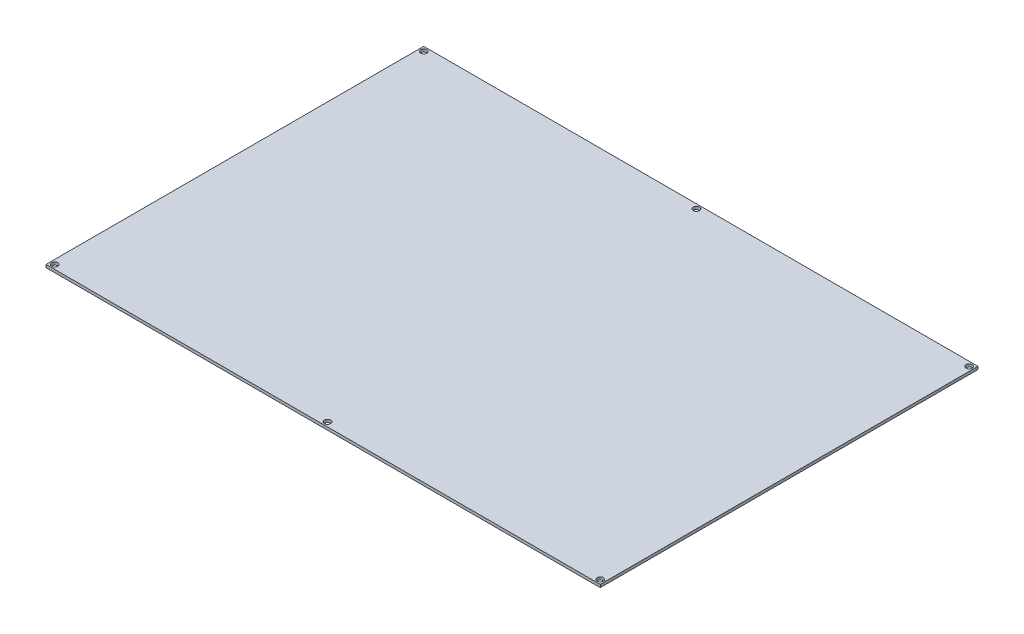
ISO-10303-21;
HEADER;
FILE_DESCRIPTION(('STEP AP214'),'2;1');
FILE_NAME('part.step','',(''),(''),'','','');
FILE_SCHEMA(('AUTOMOTIVE_DESIGN { 1 0 10303 214 1 1 1 1 }'));
ENDSEC;
DATA;
#1=APPLICATION_CONTEXT('core data for automotive mechanical design processes');
#2=APPLICATION_PROTOCOL_DEFINITION('international standard','automotive_design',2000,#1);
#3=PRODUCT_CONTEXT('',#1,'mechanical');
#4=PRODUCT('Part','Part','',(#3));
#5=PRODUCT_RELATED_PRODUCT_CATEGORY('part','',(#4));
#6=PRODUCT_DEFINITION_FORMATION('','',#4);
#7=PRODUCT_DEFINITION_CONTEXT('part definition',#1,'design');
#8=PRODUCT_DEFINITION('design','',#6,#7);
#9=PRODUCT_DEFINITION_SHAPE('','',#8);
#10=(LENGTH_UNIT() NAMED_UNIT(*) SI_UNIT(.MILLI.,.METRE.));
#11=(NAMED_UNIT(*) PLANE_ANGLE_UNIT() SI_UNIT($,.RADIAN.));
#12=(NAMED_UNIT(*) SI_UNIT($,.STERADIAN.) SOLID_ANGLE_UNIT());
#13=UNCERTAINTY_MEASURE_WITH_UNIT(LENGTH_MEASURE(1.E-05),#10,'distance_accuracy_value','');
#14=(GEOMETRIC_REPRESENTATION_CONTEXT(3) GLOBAL_UNCERTAINTY_ASSIGNED_CONTEXT((#13)) GLOBAL_UNIT_ASSIGNED_CONTEXT((#10,
#11,#12)) REPRESENTATION_CONTEXT('',''));
#15=CARTESIAN_POINT('',(0.,0.,0.));
#16=DIRECTION('',(0.,0.,1.));
#17=DIRECTION('',(1.,0.,0.));
#18=AXIS2_PLACEMENT_3D('',#15,#16,#17);
#19=CARTESIAN_POINT('',(0.,1.6,0.));
#20=DIRECTION('',(1.,0.,0.));
#21=DIRECTION('',(0.,0.,-1.));
#22=AXIS2_PLACEMENT_3D('',#19,#20,#21);
#23=PLANE('',#22);
#24=DIRECTION('',(0.,0.,1.));
#25=VECTOR('',#24,1.);
#26=CARTESIAN_POINT('',(0.,0.,0.));
#27=LINE('',#26,#25);
#28=CARTESIAN_POINT('',(0.,0.,-214.));
#29=VERTEX_POINT('',#28);
#30=CARTESIAN_POINT('',(0.,0.,0.));
#31=VERTEX_POINT('',#30);
#32=EDGE_CURVE('E95',#29,#31,#27,.T.);
#33=ORIENTED_EDGE('',*,*,#32,.T.);
#34=DIRECTION('',(0.,-1.,0.));
#35=VECTOR('',#34,1.);
#36=CARTESIAN_POINT('',(0.,1.6,0.));
#37=LINE('',#36,#35);
#38=CARTESIAN_POINT('',(0.,1.6,0.));
#39=VERTEX_POINT('',#38);
#40=EDGE_CURVE('E11',#39,#31,#37,.T.);
#41=ORIENTED_EDGE('',*,*,#40,.F.);
#42=DIRECTION('',(0.,0.,1.));
#43=VECTOR('',#42,1.);
#44=CARTESIAN_POINT('',(0.,1.6,0.));
#45=LINE('',#44,#43);
#46=CARTESIAN_POINT('',(0.,1.6,-214.));
#47=VERTEX_POINT('',#46);
#48=EDGE_CURVE('E83',#47,#39,#45,.T.);
#49=ORIENTED_EDGE('',*,*,#48,.F.);
#50=DIRECTION('',(0.,-1.,0.));
#51=VECTOR('',#50,1.);
#52=CARTESIAN_POINT('',(0.,1.6,-214.));
#53=LINE('',#52,#51);
#54=EDGE_CURVE('E91',#47,#29,#53,.T.);
#55=ORIENTED_EDGE('',*,*,#54,.T.);
#56=EDGE_LOOP('',(#33,#41,#49,#55));
#57=FACE_BOUND('',#56,.T.);
#58=ADVANCED_FACE('F32',(#57),#23,.F.);
#59=CARTESIAN_POINT('',(0.,1.6,0.));
#60=DIRECTION('',(0.,0.,-1.));
#61=DIRECTION('',(-1.,0.,0.));
#62=AXIS2_PLACEMENT_3D('',#59,#60,#61);
#63=PLANE('',#62);
#64=DIRECTION('',(1.,0.,0.));
#65=VECTOR('',#64,1.);
#66=CARTESIAN_POINT('',(0.,0.,0.));
#67=LINE('',#66,#65);
#68=CARTESIAN_POINT('',(314.,0.,0.));
#69=VERTEX_POINT('',#68);
#70=EDGE_CURVE('E87',#31,#69,#67,.T.);
#71=ORIENTED_EDGE('',*,*,#70,.T.);
#72=DIRECTION('',(0.,-1.,0.));
#73=VECTOR('',#72,1.);
#74=CARTESIAN_POINT('',(314.,1.6,0.));
#75=LINE('',#74,#73);
#76=CARTESIAN_POINT('',(314.,1.6,0.));
#77=VERTEX_POINT('',#76);
#78=EDGE_CURVE('E40',#77,#69,#75,.T.);
#79=ORIENTED_EDGE('',*,*,#78,.F.);
#80=DIRECTION('',(1.,0.,0.));
#81=VECTOR('',#80,1.);
#82=CARTESIAN_POINT('',(0.,1.6,0.));
#83=LINE('',#82,#81);
#84=EDGE_CURVE('E78',#39,#77,#83,.T.);
#85=ORIENTED_EDGE('',*,*,#84,.F.);
#86=ORIENTED_EDGE('',*,*,#40,.T.);
#87=EDGE_LOOP('',(#71,#79,#85,#86));
#88=FACE_BOUND('',#87,.T.);
#89=ADVANCED_FACE('F86',(#88),#63,.F.);
#90=CARTESIAN_POINT('',(314.,1.6,0.));
#91=DIRECTION('',(-1.,0.,0.));
#92=DIRECTION('',(0.,0.,1.));
#93=AXIS2_PLACEMENT_3D('',#90,#91,#92);
#94=PLANE('',#93);
#95=DIRECTION('',(0.,0.,-1.));
#96=VECTOR('',#95,1.);
#97=CARTESIAN_POINT('',(314.,0.,0.));
#98=LINE('',#97,#96);
#99=CARTESIAN_POINT('',(314.,0.,-214.));
#100=VERTEX_POINT('',#99);
#101=EDGE_CURVE('E65',#69,#100,#98,.T.);
#102=ORIENTED_EDGE('',*,*,#101,.T.);
#103=DIRECTION('',(0.,-1.,0.));
#104=VECTOR('',#103,1.);
#105=CARTESIAN_POINT('',(314.,1.6,-214.));
#106=LINE('',#105,#104);
#107=CARTESIAN_POINT('',(314.,1.6,-214.));
#108=VERTEX_POINT('',#107);
#109=EDGE_CURVE('E88',#108,#100,#106,.T.);
#110=ORIENTED_EDGE('',*,*,#109,.F.);
#111=DIRECTION('',(0.,0.,-1.));
#112=VECTOR('',#111,1.);
#113=CARTESIAN_POINT('',(314.,1.6,0.));
#114=LINE('',#113,#112);
#115=EDGE_CURVE('E81',#77,#108,#114,.T.);
#116=ORIENTED_EDGE('',*,*,#115,.F.);
#117=ORIENTED_EDGE('',*,*,#78,.T.);
#118=EDGE_LOOP('',(#102,#110,#116,#117));
#119=FACE_BOUND('',#118,.T.);
#120=ADVANCED_FACE('F89',(#119),#94,.F.);
#121=CARTESIAN_POINT('',(0.,1.6,-214.));
#122=DIRECTION('',(0.,0.,1.));
#123=DIRECTION('',(1.,0.,0.));
#124=AXIS2_PLACEMENT_3D('',#121,#122,#123);
#125=PLANE('',#124);
#126=DIRECTION('',(-1.,0.,0.));
#127=VECTOR('',#126,1.);
#128=CARTESIAN_POINT('',(0.,0.,-214.));
#129=LINE('',#128,#127);
#130=EDGE_CURVE('E71',#100,#29,#129,.T.);
#131=ORIENTED_EDGE('',*,*,#130,.T.);
#132=ORIENTED_EDGE('',*,*,#54,.F.);
#133=DIRECTION('',(-1.,0.,0.));
#134=VECTOR('',#133,1.);
#135=CARTESIAN_POINT('',(0.,1.6,-214.));
#136=LINE('',#135,#134);
#137=EDGE_CURVE('E48',#108,#47,#136,.T.);
#138=ORIENTED_EDGE('',*,*,#137,.F.);
#139=ORIENTED_EDGE('',*,*,#109,.T.);
#140=EDGE_LOOP('',(#131,#132,#138,#139));
#141=FACE_BOUND('',#140,.T.);
#142=ADVANCED_FACE('F103',(#141),#125,.F.);
#143=CARTESIAN_POINT('',(0.,1.6,0.));
#144=DIRECTION('',(0.,-1.,0.));
#145=DIRECTION('',(0.,0.,-1.));
#146=AXIS2_PLACEMENT_3D('',#143,#144,#145);
#147=PLANE('',#146);
#148=CARTESIAN_POINT('',(157.,1.6,-2.5));
#149=DIRECTION('',(0.,1.,0.));
#150=DIRECTION('',(0.,0.,1.));
#151=AXIS2_PLACEMENT_3D('',#148,#149,#150);
#152=CIRCLE('',#151,1.75000000000001);
#153=CARTESIAN_POINT('',(157.,1.6,-0.749999999999993));
#154=VERTEX_POINT('',#153);
#155=EDGE_CURVE('E127',#154,#154,#152,.T.);
#156=ORIENTED_EDGE('',*,*,#155,.F.);
#157=EDGE_LOOP('',(#156));
#158=FACE_BOUND('',#157,.T.);
#159=CARTESIAN_POINT('',(311.5,1.6,-211.5));
#160=DIRECTION('',(0.,1.,0.));
#161=DIRECTION('',(0.,0.,1.));
#162=AXIS2_PLACEMENT_3D('',#159,#160,#161);
#163=CIRCLE('',#162,1.74999999999998);
#164=CARTESIAN_POINT('',(311.5,1.6,-209.75));
#165=VERTEX_POINT('',#164);
#166=EDGE_CURVE('E134',#165,#165,#163,.T.);
#167=ORIENTED_EDGE('',*,*,#166,.F.);
#168=EDGE_LOOP('',(#167));
#169=FACE_BOUND('',#168,.T.);
#170=CARTESIAN_POINT('',(2.49999999999995,1.6,-211.5));
#171=DIRECTION('',(0.,1.,0.));
#172=DIRECTION('',(0.,0.,1.));
#173=AXIS2_PLACEMENT_3D('',#170,#171,#172);
#174=CIRCLE('',#173,1.75);
#175=CARTESIAN_POINT('',(2.49999999999995,1.6,-209.75));
#176=VERTEX_POINT('',#175);
#177=EDGE_CURVE('E115',#176,#176,#174,.T.);
#178=ORIENTED_EDGE('',*,*,#177,.F.);
#179=EDGE_LOOP('',(#178));
#180=FACE_BOUND('',#179,.T.);
#181=CARTESIAN_POINT('',(311.5,1.6,-2.5));
#182=DIRECTION('',(0.,1.,0.));
#183=DIRECTION('',(0.,0.,1.));
#184=AXIS2_PLACEMENT_3D('',#181,#182,#183);
#185=CIRCLE('',#184,1.74999999999998);
#186=CARTESIAN_POINT('',(311.5,1.6,-0.750000000000021));
#187=VERTEX_POINT('',#186);
#188=EDGE_CURVE('E122',#187,#187,#185,.T.);
#189=ORIENTED_EDGE('',*,*,#188,.F.);
#190=EDGE_LOOP('',(#189));
#191=FACE_BOUND('',#190,.T.);
#192=CARTESIAN_POINT('',(157.,1.6,-211.5));
#193=DIRECTION('',(0.,1.,0.));
#194=DIRECTION('',(0.,0.,1.));
#195=AXIS2_PLACEMENT_3D('',#192,#193,#194);
#196=CIRCLE('',#195,1.75000000000001);
#197=CARTESIAN_POINT('',(157.,1.6,-209.75));
#198=VERTEX_POINT('',#197);
#199=EDGE_CURVE('E139',#198,#198,#196,.T.);
#200=ORIENTED_EDGE('',*,*,#199,.F.);
#201=EDGE_LOOP('',(#200));
#202=FACE_BOUND('',#201,.T.);
#203=CARTESIAN_POINT('',(2.49999999999994,1.6,-2.5));
#204=DIRECTION('',(0.,1.,0.));
#205=DIRECTION('',(0.,0.,1.));
#206=AXIS2_PLACEMENT_3D('',#203,#204,#205);
#207=CIRCLE('',#206,1.75);
#208=CARTESIAN_POINT('',(2.49999999999994,1.6,-0.750000000000001));
#209=VERTEX_POINT('',#208);
#210=EDGE_CURVE('E109',#209,#209,#207,.T.);
#211=ORIENTED_EDGE('',*,*,#210,.F.);
#212=EDGE_LOOP('',(#211));
#213=FACE_BOUND('',#212,.T.);
#214=ORIENTED_EDGE('',*,*,#48,.T.);
#215=ORIENTED_EDGE('',*,*,#84,.T.);
#216=ORIENTED_EDGE('',*,*,#115,.T.);
#217=ORIENTED_EDGE('',*,*,#137,.T.);
#218=EDGE_LOOP('',(#214,#215,#216,#217));
#219=FACE_BOUND('',#218,.T.);
#220=ADVANCED_FACE('F79',(#158,#169,#180,#191,#202,#213,#219),#147,.F.);
#221=CARTESIAN_POINT('',(0.,0.,0.));
#222=DIRECTION('',(0.,-1.,0.));
#223=DIRECTION('',(0.,0.,-1.));
#224=AXIS2_PLACEMENT_3D('',#221,#222,#223);
#225=PLANE('',#224);
#226=CARTESIAN_POINT('',(157.,0.,-2.5));
#227=DIRECTION('',(0.,1.,0.));
#228=DIRECTION('',(0.,0.,1.));
#229=AXIS2_PLACEMENT_3D('',#226,#227,#228);
#230=CIRCLE('',#229,1.75000000000001);
#231=CARTESIAN_POINT('',(157.,0.,-0.749999999999993));
#232=VERTEX_POINT('',#231);
#233=EDGE_CURVE('E130',#232,#232,#230,.T.);
#234=ORIENTED_EDGE('',*,*,#233,.T.);
#235=EDGE_LOOP('',(#234));
#236=FACE_BOUND('',#235,.T.);
#237=CARTESIAN_POINT('',(311.5,0.,-211.5));
#238=DIRECTION('',(0.,1.,0.));
#239=DIRECTION('',(0.,0.,1.));
#240=AXIS2_PLACEMENT_3D('',#237,#238,#239);
#241=CIRCLE('',#240,1.74999999999998);
#242=CARTESIAN_POINT('',(311.5,0.,-209.75));
#243=VERTEX_POINT('',#242);
#244=EDGE_CURVE('E119',#243,#243,#241,.T.);
#245=ORIENTED_EDGE('',*,*,#244,.T.);
#246=EDGE_LOOP('',(#245));
#247=FACE_BOUND('',#246,.T.);
#248=CARTESIAN_POINT('',(2.49999999999995,0.,-211.5));
#249=DIRECTION('',(0.,1.,0.));
#250=DIRECTION('',(0.,0.,1.));
#251=AXIS2_PLACEMENT_3D('',#248,#249,#250);
#252=CIRCLE('',#251,1.75);
#253=CARTESIAN_POINT('',(2.49999999999995,0.,-209.75));
#254=VERTEX_POINT('',#253);
#255=EDGE_CURVE('E118',#254,#254,#252,.T.);
#256=ORIENTED_EDGE('',*,*,#255,.T.);
#257=EDGE_LOOP('',(#256));
#258=FACE_BOUND('',#257,.T.);
#259=CARTESIAN_POINT('',(311.5,0.,-2.5));
#260=DIRECTION('',(0.,1.,0.));
#261=DIRECTION('',(0.,0.,1.));
#262=AXIS2_PLACEMENT_3D('',#259,#260,#261);
#263=CIRCLE('',#262,1.74999999999998);
#264=CARTESIAN_POINT('',(311.5,0.,-0.750000000000021));
#265=VERTEX_POINT('',#264);
#266=EDGE_CURVE('E112',#265,#265,#263,.T.);
#267=ORIENTED_EDGE('',*,*,#266,.T.);
#268=EDGE_LOOP('',(#267));
#269=FACE_BOUND('',#268,.T.);
#270=CARTESIAN_POINT('',(157.,0.,-211.5));
#271=DIRECTION('',(0.,1.,0.));
#272=DIRECTION('',(0.,0.,1.));
#273=AXIS2_PLACEMENT_3D('',#270,#271,#272);
#274=CIRCLE('',#273,1.75000000000001);
#275=CARTESIAN_POINT('',(157.,0.,-209.75));
#276=VERTEX_POINT('',#275);
#277=EDGE_CURVE('E131',#276,#276,#274,.T.);
#278=ORIENTED_EDGE('',*,*,#277,.T.);
#279=EDGE_LOOP('',(#278));
#280=FACE_BOUND('',#279,.T.);
#281=CARTESIAN_POINT('',(2.49999999999994,0.,-2.5));
#282=DIRECTION('',(0.,1.,0.));
#283=DIRECTION('',(0.,0.,1.));
#284=AXIS2_PLACEMENT_3D('',#281,#282,#283);
#285=CIRCLE('',#284,1.75);
#286=CARTESIAN_POINT('',(2.49999999999994,0.,-0.750000000000001));
#287=VERTEX_POINT('',#286);
#288=EDGE_CURVE('E98',#287,#287,#285,.T.);
#289=ORIENTED_EDGE('',*,*,#288,.T.);
#290=EDGE_LOOP('',(#289));
#291=FACE_BOUND('',#290,.T.);
#292=ORIENTED_EDGE('',*,*,#32,.F.);
#293=ORIENTED_EDGE('',*,*,#130,.F.);
#294=ORIENTED_EDGE('',*,*,#101,.F.);
#295=ORIENTED_EDGE('',*,*,#70,.F.);
#296=EDGE_LOOP('',(#292,#293,#294,#295));
#297=FACE_BOUND('',#296,.T.);
#298=ADVANCED_FACE('F106',(#236,#247,#258,#269,#280,#291,#297),#225,.T.);
#299=CARTESIAN_POINT('',(2.49999999999994,0.,-2.5));
#300=DIRECTION('',(0.,1.,0.));
#301=DIRECTION('',(0.,0.,1.));
#302=AXIS2_PLACEMENT_3D('',#299,#300,#301);
#303=CYLINDRICAL_SURFACE('',#302,1.75);
#304=ORIENTED_EDGE('',*,*,#288,.F.);
#305=EDGE_LOOP('',(#304));
#306=FACE_BOUND('',#305,.T.);
#307=ORIENTED_EDGE('',*,*,#210,.T.);
#308=EDGE_LOOP('',(#307));
#309=FACE_BOUND('',#308,.T.);
#310=ADVANCED_FACE('F151',(#306,#309),#303,.F.);
#311=CARTESIAN_POINT('',(157.,0.,-211.5));
#312=DIRECTION('',(0.,1.,0.));
#313=DIRECTION('',(0.,0.,1.));
#314=AXIS2_PLACEMENT_3D('',#311,#312,#313);
#315=CYLINDRICAL_SURFACE('',#314,1.75000000000001);
#316=ORIENTED_EDGE('',*,*,#277,.F.);
#317=EDGE_LOOP('',(#316));
#318=FACE_BOUND('',#317,.T.);
#319=ORIENTED_EDGE('',*,*,#199,.T.);
#320=EDGE_LOOP('',(#319));
#321=FACE_BOUND('',#320,.T.);
#322=ADVANCED_FACE('F147',(#318,#321),#315,.F.);
#323=CARTESIAN_POINT('',(311.5,0.,-2.5));
#324=DIRECTION('',(0.,1.,0.));
#325=DIRECTION('',(0.,0.,1.));
#326=AXIS2_PLACEMENT_3D('',#323,#324,#325);
#327=CYLINDRICAL_SURFACE('',#326,1.74999999999998);
#328=ORIENTED_EDGE('',*,*,#266,.F.);
#329=EDGE_LOOP('',(#328));
#330=FACE_BOUND('',#329,.T.);
#331=ORIENTED_EDGE('',*,*,#188,.T.);
#332=EDGE_LOOP('',(#331));
#333=FACE_BOUND('',#332,.T.);
#334=ADVANCED_FACE('F150',(#330,#333),#327,.F.);
#335=CARTESIAN_POINT('',(2.49999999999995,0.,-211.5));
#336=DIRECTION('',(0.,1.,0.));
#337=DIRECTION('',(0.,0.,1.));
#338=AXIS2_PLACEMENT_3D('',#335,#336,#337);
#339=CYLINDRICAL_SURFACE('',#338,1.75);
#340=ORIENTED_EDGE('',*,*,#255,.F.);
#341=EDGE_LOOP('',(#340));
#342=FACE_BOUND('',#341,.T.);
#343=ORIENTED_EDGE('',*,*,#177,.T.);
#344=EDGE_LOOP('',(#343));
#345=FACE_BOUND('',#344,.T.);
#346=ADVANCED_FACE('F212',(#342,#345),#339,.F.);
#347=CARTESIAN_POINT('',(311.5,0.,-211.5));
#348=DIRECTION('',(0.,1.,0.));
#349=DIRECTION('',(0.,0.,1.));
#350=AXIS2_PLACEMENT_3D('',#347,#348,#349);
#351=CYLINDRICAL_SURFACE('',#350,1.74999999999998);
#352=ORIENTED_EDGE('',*,*,#244,.F.);
#353=EDGE_LOOP('',(#352));
#354=FACE_BOUND('',#353,.T.);
#355=ORIENTED_EDGE('',*,*,#166,.T.);
#356=EDGE_LOOP('',(#355));
#357=FACE_BOUND('',#356,.T.);
#358=ADVANCED_FACE('F222',(#354,#357),#351,.F.);
#359=CARTESIAN_POINT('',(157.,0.,-2.5));
#360=DIRECTION('',(0.,1.,0.));
#361=DIRECTION('',(0.,0.,1.));
#362=AXIS2_PLACEMENT_3D('',#359,#360,#361);
#363=CYLINDRICAL_SURFACE('',#362,1.75000000000001);
#364=ORIENTED_EDGE('',*,*,#233,.F.);
#365=EDGE_LOOP('',(#364));
#366=FACE_BOUND('',#365,.T.);
#367=ORIENTED_EDGE('',*,*,#155,.T.);
#368=EDGE_LOOP('',(#367));
#369=FACE_BOUND('',#368,.T.);
#370=ADVANCED_FACE('F231',(#366,#369),#363,.F.);
#371=CLOSED_SHELL('',(#58,#89,#120,#142,#220,#298,#310,#322,#334,#346,#358,#370));
#372=MANIFOLD_SOLID_BREP('B2',#371);
#373=ADVANCED_BREP_SHAPE_REPRESENTATION('',(#18,#372),#14);
#374=SHAPE_DEFINITION_REPRESENTATION(#9,#373);
ENDSEC;
END-ISO-10303-21;
